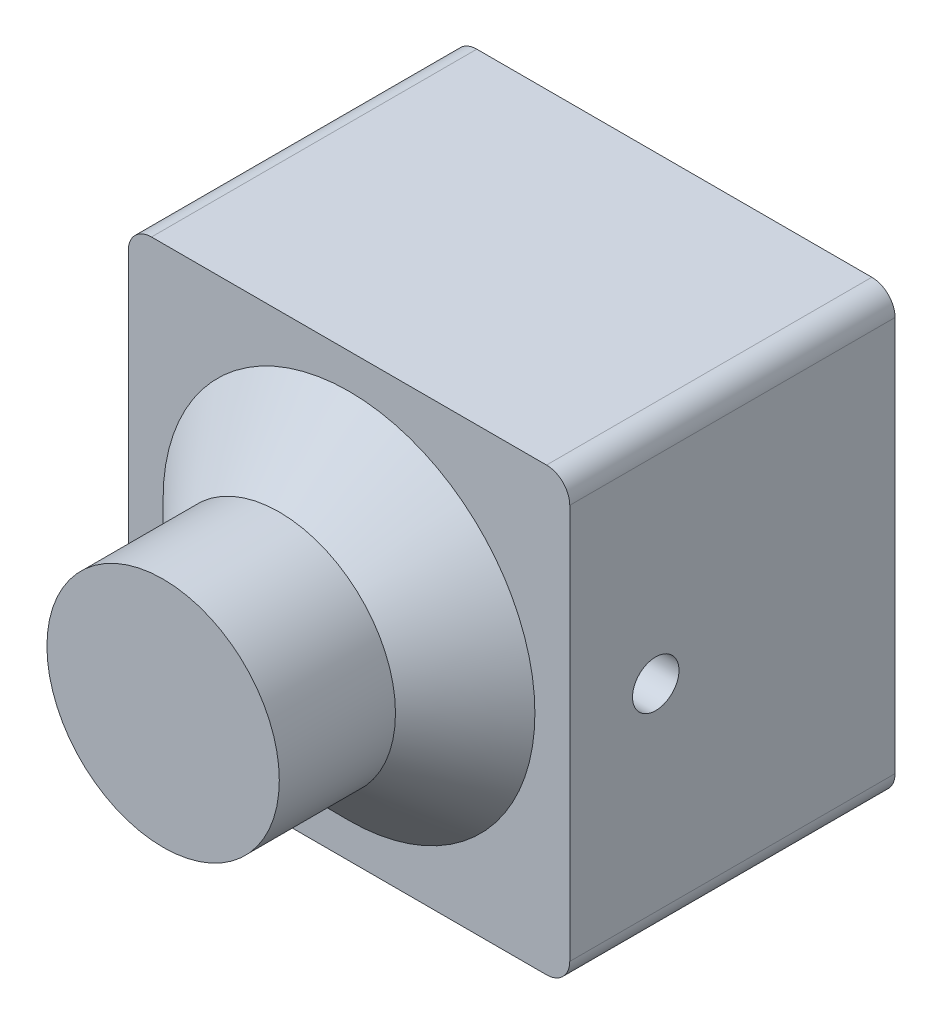
ISO-10303-21;
HEADER;
FILE_DESCRIPTION(('STEP AP214'),'2;1');
FILE_NAME('part.step','',(''),(''),'','','');
FILE_SCHEMA(('AUTOMOTIVE_DESIGN { 1 0 10303 214 1 1 1 1 }'));
ENDSEC;
DATA;
#1=APPLICATION_CONTEXT('core data for automotive mechanical design processes');
#2=APPLICATION_PROTOCOL_DEFINITION('international standard','automotive_design',2000,#1);
#3=PRODUCT_CONTEXT('',#1,'mechanical');
#4=PRODUCT('Part','Part','',(#3));
#5=PRODUCT_RELATED_PRODUCT_CATEGORY('part','',(#4));
#6=PRODUCT_DEFINITION_FORMATION('','',#4);
#7=PRODUCT_DEFINITION_CONTEXT('part definition',#1,'design');
#8=PRODUCT_DEFINITION('design','',#6,#7);
#9=PRODUCT_DEFINITION_SHAPE('','',#8);
#10=(LENGTH_UNIT() NAMED_UNIT(*) SI_UNIT(.MILLI.,.METRE.));
#11=(NAMED_UNIT(*) PLANE_ANGLE_UNIT() SI_UNIT($,.RADIAN.));
#12=(NAMED_UNIT(*) SI_UNIT($,.STERADIAN.) SOLID_ANGLE_UNIT());
#13=UNCERTAINTY_MEASURE_WITH_UNIT(LENGTH_MEASURE(1.E-05),#10,'distance_accuracy_value','');
#14=(GEOMETRIC_REPRESENTATION_CONTEXT(3) GLOBAL_UNCERTAINTY_ASSIGNED_CONTEXT((#13)) GLOBAL_UNIT_ASSIGNED_CONTEXT((#10,
#11,#12)) REPRESENTATION_CONTEXT('',''));
#15=CARTESIAN_POINT('',(0.,0.,0.));
#16=DIRECTION('',(0.,0.,1.));
#17=DIRECTION('',(1.,0.,0.));
#18=AXIS2_PLACEMENT_3D('',#15,#16,#17);
#19=CARTESIAN_POINT('',(56.7274337707558,61.4616075226777,14.));
#20=DIRECTION('',(1.,0.,0.));
#21=DIRECTION('',(0.,1.,0.));
#22=AXIS2_PLACEMENT_3D('',#19,#20,#21);
#23=PLANE('',#22);
#24=CARTESIAN_POINT('',(56.7274337707558,51.9616075226777,10.3));
#25=DIRECTION('',(-1.,0.,0.));
#26=DIRECTION('',(0.,-1.,0.));
#27=AXIS2_PLACEMENT_3D('',#24,#25,#26);
#28=CIRCLE('',#27,1.);
#29=CARTESIAN_POINT('',(56.7274337707558,50.9616075226777,10.3));
#30=VERTEX_POINT('',#29);
#31=EDGE_CURVE('E232',#30,#30,#28,.T.);
#32=ORIENTED_EDGE('',*,*,#31,.F.);
#33=EDGE_LOOP('',(#32));
#34=FACE_BOUND('',#33,.T.);
#35=DIRECTION('',(0.,-1.,0.));
#36=VECTOR('',#35,1.);
#37=CARTESIAN_POINT('',(56.7274337707558,61.4616075226777,0.));
#38=LINE('',#37,#36);
#39=CARTESIAN_POINT('',(56.7274337707558,60.4616075226777,0.));
#40=VERTEX_POINT('',#39);
#41=CARTESIAN_POINT('',(56.7274337707557,43.4616075226777,0.));
#42=VERTEX_POINT('',#41);
#43=EDGE_CURVE('E134',#40,#42,#38,.T.);
#44=ORIENTED_EDGE('',*,*,#43,.T.);
#45=DIRECTION('',(0.,0.,-1.));
#46=VECTOR('',#45,1.);
#47=CARTESIAN_POINT('',(56.7274337707557,43.4616075226777,14.));
#48=LINE('',#47,#46);
#49=CARTESIAN_POINT('',(56.7274337707557,43.4616075226777,14.));
#50=VERTEX_POINT('',#49);
#51=EDGE_CURVE('E156',#42,#50,#48,.F.);
#52=ORIENTED_EDGE('',*,*,#51,.T.);
#53=DIRECTION('',(0.,-1.,0.));
#54=VECTOR('',#53,1.);
#55=CARTESIAN_POINT('',(56.7274337707558,61.4616075226777,14.));
#56=LINE('',#55,#54);
#57=CARTESIAN_POINT('',(56.7274337707558,60.4616075226777,14.));
#58=VERTEX_POINT('',#57);
#59=EDGE_CURVE('E132',#58,#50,#56,.T.);
#60=ORIENTED_EDGE('',*,*,#59,.F.);
#61=DIRECTION('',(0.,0.,-1.));
#62=VECTOR('',#61,1.);
#63=CARTESIAN_POINT('',(56.7274337707558,60.4616075226777,14.));
#64=LINE('',#63,#62);
#65=EDGE_CURVE('E153',#58,#40,#64,.T.);
#66=ORIENTED_EDGE('',*,*,#65,.T.);
#67=EDGE_LOOP('',(#44,#52,#60,#66));
#68=FACE_BOUND('',#67,.T.);
#69=ADVANCED_FACE('F35',(#34,#68),#23,.F.);
#70=CARTESIAN_POINT('',(56.7274337707557,42.4616075226777,14.));
#71=DIRECTION('',(0.,1.,0.));
#72=DIRECTION('',(0.,0.,1.));
#73=AXIS2_PLACEMENT_3D('',#70,#71,#72);
#74=PLANE('',#73);
#75=DIRECTION('',(1.,0.,0.));
#76=VECTOR('',#75,1.);
#77=CARTESIAN_POINT('',(56.7274337707557,42.4616075226777,0.));
#78=LINE('',#77,#76);
#79=CARTESIAN_POINT('',(57.7274337707557,42.4616075226777,0.));
#80=VERTEX_POINT('',#79);
#81=CARTESIAN_POINT('',(74.7274337707558,42.4616075226777,0.));
#82=VERTEX_POINT('',#81);
#83=EDGE_CURVE('E130',#80,#82,#78,.T.);
#84=ORIENTED_EDGE('',*,*,#83,.T.);
#85=DIRECTION('',(0.,0.,-1.));
#86=VECTOR('',#85,1.);
#87=CARTESIAN_POINT('',(74.7274337707558,42.4616075226777,14.));
#88=LINE('',#87,#86);
#89=CARTESIAN_POINT('',(74.7274337707558,42.4616075226777,14.));
#90=VERTEX_POINT('',#89);
#91=EDGE_CURVE('E108',#82,#90,#88,.F.);
#92=ORIENTED_EDGE('',*,*,#91,.T.);
#93=DIRECTION('',(1.,0.,0.));
#94=VECTOR('',#93,1.);
#95=CARTESIAN_POINT('',(56.7274337707557,42.4616075226777,14.));
#96=LINE('',#95,#94);
#97=CARTESIAN_POINT('',(57.7274337707557,42.4616075226777,14.));
#98=VERTEX_POINT('',#97);
#99=EDGE_CURVE('E220',#98,#90,#96,.T.);
#100=ORIENTED_EDGE('',*,*,#99,.F.);
#101=DIRECTION('',(0.,0.,-1.));
#102=VECTOR('',#101,1.);
#103=CARTESIAN_POINT('',(57.7274337707557,42.4616075226777,14.));
#104=LINE('',#103,#102);
#105=EDGE_CURVE('E113',#98,#80,#104,.T.);
#106=ORIENTED_EDGE('',*,*,#105,.T.);
#107=EDGE_LOOP('',(#84,#92,#100,#106));
#108=FACE_BOUND('',#107,.T.);
#109=ADVANCED_FACE('F182',(#108),#74,.F.);
#110=CARTESIAN_POINT('',(75.7274337707558,61.4616075226777,14.));
#111=DIRECTION('',(-1.,0.,0.));
#112=DIRECTION('',(0.,0.,1.));
#113=AXIS2_PLACEMENT_3D('',#110,#111,#112);
#114=PLANE('',#113);
#115=CARTESIAN_POINT('',(75.7274337707558,51.9616075226777,10.3));
#116=DIRECTION('',(1.,0.,0.));
#117=DIRECTION('',(0.,0.,-1.));
#118=AXIS2_PLACEMENT_3D('',#115,#116,#117);
#119=CIRCLE('',#118,1.);
#120=CARTESIAN_POINT('',(75.7274337707558,51.9616075226777,9.3));
#121=VERTEX_POINT('',#120);
#122=EDGE_CURVE('E239',#121,#121,#119,.T.);
#123=ORIENTED_EDGE('',*,*,#122,.F.);
#124=EDGE_LOOP('',(#123));
#125=FACE_BOUND('',#124,.T.);
#126=DIRECTION('',(0.,1.,0.));
#127=VECTOR('',#126,1.);
#128=CARTESIAN_POINT('',(75.7274337707558,61.4616075226777,14.));
#129=LINE('',#128,#127);
#130=CARTESIAN_POINT('',(75.7274337707558,43.4616075226777,14.));
#131=VERTEX_POINT('',#130);
#132=CARTESIAN_POINT('',(75.7274337707558,60.4616075226777,14.));
#133=VERTEX_POINT('',#132);
#134=EDGE_CURVE('E122',#131,#133,#129,.T.);
#135=ORIENTED_EDGE('',*,*,#134,.F.);
#136=DIRECTION('',(0.,0.,-1.));
#137=VECTOR('',#136,1.);
#138=CARTESIAN_POINT('',(75.7274337707558,43.4616075226777,14.));
#139=LINE('',#138,#137);
#140=CARTESIAN_POINT('',(75.7274337707558,43.4616075226777,0.));
#141=VERTEX_POINT('',#140);
#142=EDGE_CURVE('E107',#131,#141,#139,.T.);
#143=ORIENTED_EDGE('',*,*,#142,.T.);
#144=DIRECTION('',(0.,1.,0.));
#145=VECTOR('',#144,1.);
#146=CARTESIAN_POINT('',(75.7274337707558,61.4616075226777,0.));
#147=LINE('',#146,#145);
#148=CARTESIAN_POINT('',(75.7274337707558,60.4616075226777,0.));
#149=VERTEX_POINT('',#148);
#150=EDGE_CURVE('E120',#141,#149,#147,.T.);
#151=ORIENTED_EDGE('',*,*,#150,.T.);
#152=DIRECTION('',(0.,0.,-1.));
#153=VECTOR('',#152,1.);
#154=CARTESIAN_POINT('',(75.7274337707558,60.4616075226777,14.));
#155=LINE('',#154,#153);
#156=EDGE_CURVE('E124',#149,#133,#155,.F.);
#157=ORIENTED_EDGE('',*,*,#156,.T.);
#158=EDGE_LOOP('',(#135,#143,#151,#157));
#159=FACE_BOUND('',#158,.T.);
#160=ADVANCED_FACE('F119',(#125,#159),#114,.F.);
#161=CARTESIAN_POINT('',(56.7274337707558,61.4616075226777,14.));
#162=DIRECTION('',(0.,-1.,0.));
#163=DIRECTION('',(0.,0.,-1.));
#164=AXIS2_PLACEMENT_3D('',#161,#162,#163);
#165=PLANE('',#164);
#166=DIRECTION('',(-1.,0.,0.));
#167=VECTOR('',#166,1.);
#168=CARTESIAN_POINT('',(56.7274337707558,61.4616075226777,14.));
#169=LINE('',#168,#167);
#170=CARTESIAN_POINT('',(74.7274337707558,61.4616075226777,14.));
#171=VERTEX_POINT('',#170);
#172=CARTESIAN_POINT('',(57.7274337707558,61.4616075226777,14.));
#173=VERTEX_POINT('',#172);
#174=EDGE_CURVE('E138',#171,#173,#169,.T.);
#175=ORIENTED_EDGE('',*,*,#174,.F.);
#176=DIRECTION('',(0.,0.,-1.));
#177=VECTOR('',#176,1.);
#178=CARTESIAN_POINT('',(74.7274337707558,61.4616075226777,14.));
#179=LINE('',#178,#177);
#180=CARTESIAN_POINT('',(74.7274337707558,61.4616075226777,0.));
#181=VERTEX_POINT('',#180);
#182=EDGE_CURVE('E159',#171,#181,#179,.T.);
#183=ORIENTED_EDGE('',*,*,#182,.T.);
#184=DIRECTION('',(-1.,0.,0.));
#185=VECTOR('',#184,1.);
#186=CARTESIAN_POINT('',(56.7274337707558,61.4616075226777,0.));
#187=LINE('',#186,#185);
#188=CARTESIAN_POINT('',(57.7274337707558,61.4616075226777,0.));
#189=VERTEX_POINT('',#188);
#190=EDGE_CURVE('E129',#181,#189,#187,.T.);
#191=ORIENTED_EDGE('',*,*,#190,.T.);
#192=DIRECTION('',(0.,0.,-1.));
#193=VECTOR('',#192,1.);
#194=CARTESIAN_POINT('',(57.7274337707558,61.4616075226777,14.));
#195=LINE('',#194,#193);
#196=EDGE_CURVE('E51',#189,#173,#195,.F.);
#197=ORIENTED_EDGE('',*,*,#196,.T.);
#198=EDGE_LOOP('',(#175,#183,#191,#197));
#199=FACE_BOUND('',#198,.T.);
#200=ADVANCED_FACE('F254',(#199),#165,.F.);
#201=CARTESIAN_POINT('',(0.,0.,14.));
#202=DIRECTION('',(0.,0.,1.));
#203=DIRECTION('',(1.,0.,0.));
#204=AXIS2_PLACEMENT_3D('',#201,#202,#203);
#205=PLANE('',#204);
#206=CARTESIAN_POINT('',(66.2274337707558,51.9616075226777,14.));
#207=DIRECTION('',(0.,0.,1.));
#208=DIRECTION('',(1.,0.,0.));
#209=AXIS2_PLACEMENT_3D('',#206,#207,#208);
#210=CIRCLE('',#209,8.00000000000001);
#211=CARTESIAN_POINT('',(58.2274337707557,51.9616075226777,14.));
#212=VERTEX_POINT('',#211);
#213=EDGE_CURVE('E11',#212,#212,#210,.F.);
#214=ORIENTED_EDGE('',*,*,#213,.T.);
#215=EDGE_LOOP('',(#214));
#216=FACE_BOUND('',#215,.T.);
#217=ORIENTED_EDGE('',*,*,#99,.T.);
#218=CARTESIAN_POINT('',(74.7274337707558,43.4616075226777,14.));
#219=DIRECTION('',(0.,0.,1.));
#220=DIRECTION('',(1.,0.,0.));
#221=AXIS2_PLACEMENT_3D('',#218,#219,#220);
#222=CIRCLE('',#221,1.);
#223=EDGE_CURVE('E151',#90,#131,#222,.T.);
#224=ORIENTED_EDGE('',*,*,#223,.T.);
#225=ORIENTED_EDGE('',*,*,#134,.T.);
#226=CARTESIAN_POINT('',(74.7274337707558,60.4616075226777,14.));
#227=DIRECTION('',(0.,0.,1.));
#228=DIRECTION('',(1.,0.,0.));
#229=AXIS2_PLACEMENT_3D('',#226,#227,#228);
#230=CIRCLE('',#229,1.);
#231=EDGE_CURVE('E58',#133,#171,#230,.T.);
#232=ORIENTED_EDGE('',*,*,#231,.T.);
#233=ORIENTED_EDGE('',*,*,#174,.T.);
#234=CARTESIAN_POINT('',(57.7274337707558,60.4616075226777,14.));
#235=DIRECTION('',(0.,0.,1.));
#236=DIRECTION('',(1.,0.,0.));
#237=AXIS2_PLACEMENT_3D('',#234,#235,#236);
#238=CIRCLE('',#237,1.);
#239=EDGE_CURVE('E146',#173,#58,#238,.T.);
#240=ORIENTED_EDGE('',*,*,#239,.T.);
#241=ORIENTED_EDGE('',*,*,#59,.T.);
#242=CARTESIAN_POINT('',(57.7274337707557,43.4616075226777,14.));
#243=DIRECTION('',(0.,0.,1.));
#244=DIRECTION('',(1.,0.,0.));
#245=AXIS2_PLACEMENT_3D('',#242,#243,#244);
#246=CIRCLE('',#245,1.);
#247=EDGE_CURVE('E149',#50,#98,#246,.T.);
#248=ORIENTED_EDGE('',*,*,#247,.T.);
#249=EDGE_LOOP('',(#217,#224,#225,#232,#233,#240,#241,#248));
#250=FACE_BOUND('',#249,.T.);
#251=ADVANCED_FACE('F215',(#216,#250),#205,.T.);
#252=CARTESIAN_POINT('',(0.,0.,0.));
#253=DIRECTION('',(0.,0.,1.));
#254=DIRECTION('',(1.,0.,0.));
#255=AXIS2_PLACEMENT_3D('',#252,#253,#254);
#256=PLANE('',#255);
#257=ORIENTED_EDGE('',*,*,#150,.F.);
#258=CARTESIAN_POINT('',(74.7274337707558,43.4616075226777,0.));
#259=DIRECTION('',(0.,0.,1.));
#260=DIRECTION('',(1.,0.,0.));
#261=AXIS2_PLACEMENT_3D('',#258,#259,#260);
#262=CIRCLE('',#261,1.);
#263=EDGE_CURVE('E103',#141,#82,#262,.F.);
#264=ORIENTED_EDGE('',*,*,#263,.T.);
#265=ORIENTED_EDGE('',*,*,#83,.F.);
#266=CARTESIAN_POINT('',(57.7274337707557,43.4616075226777,0.));
#267=DIRECTION('',(0.,0.,1.));
#268=DIRECTION('',(1.,0.,0.));
#269=AXIS2_PLACEMENT_3D('',#266,#267,#268);
#270=CIRCLE('',#269,1.);
#271=EDGE_CURVE('E114',#80,#42,#270,.F.);
#272=ORIENTED_EDGE('',*,*,#271,.T.);
#273=ORIENTED_EDGE('',*,*,#43,.F.);
#274=CARTESIAN_POINT('',(57.7274337707558,60.4616075226777,0.));
#275=DIRECTION('',(0.,0.,1.));
#276=DIRECTION('',(1.,0.,0.));
#277=AXIS2_PLACEMENT_3D('',#274,#275,#276);
#278=CIRCLE('',#277,1.);
#279=EDGE_CURVE('E123',#40,#189,#278,.F.);
#280=ORIENTED_EDGE('',*,*,#279,.T.);
#281=ORIENTED_EDGE('',*,*,#190,.F.);
#282=CARTESIAN_POINT('',(74.7274337707558,60.4616075226777,0.));
#283=DIRECTION('',(0.,0.,1.));
#284=DIRECTION('',(1.,0.,0.));
#285=AXIS2_PLACEMENT_3D('',#282,#283,#284);
#286=CIRCLE('',#285,1.);
#287=EDGE_CURVE('E128',#181,#149,#286,.F.);
#288=ORIENTED_EDGE('',*,*,#287,.T.);
#289=EDGE_LOOP('',(#257,#264,#265,#272,#273,#280,#281,#288));
#290=FACE_BOUND('',#289,.T.);
#291=ADVANCED_FACE('F126',(#290),#256,.F.);
#292=CARTESIAN_POINT('',(74.7274337707558,43.4616075226777,14.));
#293=DIRECTION('',(0.,0.,-1.));
#294=DIRECTION('',(-1.,0.,0.));
#295=AXIS2_PLACEMENT_3D('',#292,#293,#294);
#296=CYLINDRICAL_SURFACE('',#295,1.);
#297=ORIENTED_EDGE('',*,*,#223,.F.);
#298=ORIENTED_EDGE('',*,*,#91,.F.);
#299=ORIENTED_EDGE('',*,*,#263,.F.);
#300=ORIENTED_EDGE('',*,*,#142,.F.);
#301=EDGE_LOOP('',(#297,#298,#299,#300));
#302=FACE_BOUND('',#301,.T.);
#303=ADVANCED_FACE('F106',(#302),#296,.T.);
#304=CARTESIAN_POINT('',(57.7274337707557,43.4616075226777,14.));
#305=DIRECTION('',(0.,0.,-1.));
#306=DIRECTION('',(-1.,0.,0.));
#307=AXIS2_PLACEMENT_3D('',#304,#305,#306);
#308=CYLINDRICAL_SURFACE('',#307,1.);
#309=ORIENTED_EDGE('',*,*,#247,.F.);
#310=ORIENTED_EDGE('',*,*,#51,.F.);
#311=ORIENTED_EDGE('',*,*,#271,.F.);
#312=ORIENTED_EDGE('',*,*,#105,.F.);
#313=EDGE_LOOP('',(#309,#310,#311,#312));
#314=FACE_BOUND('',#313,.T.);
#315=ADVANCED_FACE('F196',(#314),#308,.T.);
#316=CARTESIAN_POINT('',(74.7274337707558,60.4616075226777,14.));
#317=DIRECTION('',(0.,0.,-1.));
#318=DIRECTION('',(-1.,0.,0.));
#319=AXIS2_PLACEMENT_3D('',#316,#317,#318);
#320=CYLINDRICAL_SURFACE('',#319,1.);
#321=ORIENTED_EDGE('',*,*,#231,.F.);
#322=ORIENTED_EDGE('',*,*,#156,.F.);
#323=ORIENTED_EDGE('',*,*,#287,.F.);
#324=ORIENTED_EDGE('',*,*,#182,.F.);
#325=EDGE_LOOP('',(#321,#322,#323,#324));
#326=FACE_BOUND('',#325,.T.);
#327=ADVANCED_FACE('F199',(#326),#320,.T.);
#328=CARTESIAN_POINT('',(57.7274337707558,60.4616075226777,14.));
#329=DIRECTION('',(0.,0.,-1.));
#330=DIRECTION('',(-1.,0.,0.));
#331=AXIS2_PLACEMENT_3D('',#328,#329,#330);
#332=CYLINDRICAL_SURFACE('',#331,1.);
#333=ORIENTED_EDGE('',*,*,#239,.F.);
#334=ORIENTED_EDGE('',*,*,#196,.F.);
#335=ORIENTED_EDGE('',*,*,#279,.F.);
#336=ORIENTED_EDGE('',*,*,#65,.F.);
#337=EDGE_LOOP('',(#333,#334,#335,#336));
#338=FACE_BOUND('',#337,.T.);
#339=ADVANCED_FACE('F202',(#338),#332,.T.);
#340=CARTESIAN_POINT('',(66.2274337707558,51.9616075226777,22.));
#341=DIRECTION('',(0.,0.,-1.));
#342=DIRECTION('',(-1.,0.,0.));
#343=AXIS2_PLACEMENT_3D('',#340,#341,#342);
#344=CYLINDRICAL_SURFACE('',#343,5.00000000000001);
#345=CARTESIAN_POINT('',(66.2274337707558,51.9616075226777,17.));
#346=DIRECTION('',(0.,0.,1.));
#347=DIRECTION('',(1.,0.,0.));
#348=AXIS2_PLACEMENT_3D('',#345,#346,#347);
#349=CIRCLE('',#348,5.00000000000001);
#350=CARTESIAN_POINT('',(61.2274337707558,51.9616075226777,17.));
#351=VERTEX_POINT('',#350);
#352=EDGE_CURVE('E44',#351,#351,#349,.T.);
#353=ORIENTED_EDGE('',*,*,#352,.T.);
#354=EDGE_LOOP('',(#353));
#355=FACE_BOUND('',#354,.T.);
#356=CARTESIAN_POINT('',(66.2274337707558,51.9616075226777,22.));
#357=DIRECTION('',(0.,0.,1.));
#358=DIRECTION('',(1.,0.,0.));
#359=AXIS2_PLACEMENT_3D('',#356,#357,#358);
#360=CIRCLE('',#359,5.00000000000001);
#361=CARTESIAN_POINT('',(71.2274337707558,51.9616075226777,22.));
#362=VERTEX_POINT('',#361);
#363=EDGE_CURVE('E224',#362,#362,#360,.T.);
#364=ORIENTED_EDGE('',*,*,#363,.F.);
#365=EDGE_LOOP('',(#364));
#366=FACE_BOUND('',#365,.T.);
#367=ADVANCED_FACE('F164',(#355,#366),#344,.T.);
#368=CARTESIAN_POINT('',(66.2274337707558,51.9616075226777,22.));
#369=DIRECTION('',(0.,0.,1.));
#370=DIRECTION('',(1.,0.,0.));
#371=AXIS2_PLACEMENT_3D('',#368,#369,#370);
#372=PLANE('',#371);
#373=ORIENTED_EDGE('',*,*,#363,.T.);
#374=EDGE_LOOP('',(#373));
#375=FACE_BOUND('',#374,.T.);
#376=ADVANCED_FACE('F169',(#375),#372,.T.);
#377=CARTESIAN_POINT('',(66.2274337707558,51.9616075226777,17.));
#378=DIRECTION('',(0.,0.,-1.));
#379=DIRECTION('',(-1.,0.,0.));
#380=AXIS2_PLACEMENT_3D('',#377,#378,#379);
#381=CONICAL_SURFACE('',#380,5.00000000000001,0.785398163397443);
#382=CARTESIAN_POINT('',(58.2274337707557,51.9616075226777,14.));
#383=CARTESIAN_POINT('',(58.2586837707558,51.9616075226777,14.03125));
#384=CARTESIAN_POINT('',(58.2899337707557,51.9616075226777,14.0625));
#385=CARTESIAN_POINT('',(58.3524337707557,51.9616075226777,14.125));
#386=CARTESIAN_POINT('',(58.3836837707558,51.9616075226777,14.15625));
#387=CARTESIAN_POINT('',(58.4461837707557,51.9616075226777,14.21875));
#388=CARTESIAN_POINT('',(58.4774337707557,51.9616075226777,14.25));
#389=CARTESIAN_POINT('',(58.5399337707557,51.9616075226777,14.3125));
#390=CARTESIAN_POINT('',(58.5711837707557,51.9616075226777,14.34375));
#391=CARTESIAN_POINT('',(58.6336837707557,51.9616075226777,14.40625));
#392=CARTESIAN_POINT('',(58.6649337707557,51.9616075226777,14.4375));
#393=CARTESIAN_POINT('',(58.7274337707557,51.9616075226777,14.5));
#394=CARTESIAN_POINT('',(58.7586837707557,51.9616075226777,14.53125));
#395=CARTESIAN_POINT('',(58.8211837707557,51.9616075226777,14.59375));
#396=CARTESIAN_POINT('',(58.8524337707557,51.9616075226777,14.625));
#397=CARTESIAN_POINT('',(58.9149337707557,51.9616075226777,14.6875));
#398=CARTESIAN_POINT('',(58.9461837707557,51.9616075226777,14.71875));
#399=CARTESIAN_POINT('',(59.0086837707557,51.9616075226777,14.78125));
#400=CARTESIAN_POINT('',(59.0399337707557,51.9616075226777,14.8125));
#401=CARTESIAN_POINT('',(59.1024337707557,51.9616075226777,14.875));
#402=CARTESIAN_POINT('',(59.1336837707557,51.9616075226777,14.90625));
#403=CARTESIAN_POINT('',(59.1961837707557,51.9616075226777,14.96875));
#404=CARTESIAN_POINT('',(59.2274337707557,51.9616075226777,15.));
#405=CARTESIAN_POINT('',(59.2899337707557,51.9616075226777,15.0625));
#406=CARTESIAN_POINT('',(59.3211837707557,51.9616075226777,15.09375));
#407=CARTESIAN_POINT('',(59.3836837707557,51.9616075226777,15.15625));
#408=CARTESIAN_POINT('',(59.4149337707557,51.9616075226777,15.1875));
#409=CARTESIAN_POINT('',(59.4774337707557,51.9616075226777,15.25));
#410=CARTESIAN_POINT('',(59.5086837707557,51.9616075226777,15.28125));
#411=CARTESIAN_POINT('',(59.5711837707557,51.9616075226777,15.34375));
#412=CARTESIAN_POINT('',(59.6024337707557,51.9616075226777,15.375));
#413=CARTESIAN_POINT('',(59.6649337707557,51.9616075226777,15.4375));
#414=CARTESIAN_POINT('',(59.6961837707557,51.9616075226777,15.46875));
#415=CARTESIAN_POINT('',(59.7586837707557,51.9616075226777,15.53125));
#416=CARTESIAN_POINT('',(59.7899337707557,51.9616075226777,15.5625));
#417=CARTESIAN_POINT('',(59.8524337707557,51.9616075226777,15.625));
#418=CARTESIAN_POINT('',(59.8836837707557,51.9616075226777,15.65625));
#419=CARTESIAN_POINT('',(59.9461837707557,51.9616075226777,15.71875));
#420=CARTESIAN_POINT('',(59.9774337707557,51.9616075226777,15.75));
#421=CARTESIAN_POINT('',(60.0399337707557,51.9616075226777,15.8125));
#422=CARTESIAN_POINT('',(60.0711837707557,51.9616075226777,15.84375));
#423=CARTESIAN_POINT('',(60.1336837707557,51.9616075226777,15.90625));
#424=CARTESIAN_POINT('',(60.1649337707557,51.9616075226777,15.9375));
#425=CARTESIAN_POINT('',(60.2274337707557,51.9616075226777,16.));
#426=CARTESIAN_POINT('',(60.2586837707557,51.9616075226777,16.03125));
#427=CARTESIAN_POINT('',(60.3211837707557,51.9616075226777,16.09375));
#428=CARTESIAN_POINT('',(60.3524337707557,51.9616075226777,16.125));
#429=CARTESIAN_POINT('',(60.4149337707557,51.9616075226777,16.1875));
#430=CARTESIAN_POINT('',(60.4461837707557,51.9616075226777,16.21875));
#431=CARTESIAN_POINT('',(60.5086837707557,51.9616075226777,16.28125));
#432=CARTESIAN_POINT('',(60.5399337707557,51.9616075226777,16.3125));
#433=CARTESIAN_POINT('',(60.6024337707557,51.9616075226777,16.375));
#434=CARTESIAN_POINT('',(60.6336837707557,51.9616075226777,16.40625));
#435=CARTESIAN_POINT('',(60.6961837707557,51.9616075226777,16.46875));
#436=CARTESIAN_POINT('',(60.7274337707557,51.9616075226777,16.5));
#437=CARTESIAN_POINT('',(60.7899337707557,51.9616075226777,16.5625));
#438=CARTESIAN_POINT('',(60.8211837707557,51.9616075226777,16.59375));
#439=CARTESIAN_POINT('',(60.8836837707557,51.9616075226777,16.65625));
#440=CARTESIAN_POINT('',(60.9149337707557,51.9616075226777,16.6875));
#441=CARTESIAN_POINT('',(60.9774337707557,51.9616075226777,16.75));
#442=CARTESIAN_POINT('',(61.0086837707557,51.9616075226777,16.78125));
#443=CARTESIAN_POINT('',(61.0711837707557,51.9616075226777,16.84375));
#444=CARTESIAN_POINT('',(61.1024337707558,51.9616075226777,16.875));
#445=CARTESIAN_POINT('',(61.1649337707558,51.9616075226777,16.9375));
#446=CARTESIAN_POINT('',(61.1961837707557,51.9616075226777,16.96875));
#447=CARTESIAN_POINT('',(61.2274337707558,51.9616075226777,17.));
#448=B_SPLINE_CURVE_WITH_KNOTS('',3,(#382,#383,#384,#385,#386,#387,#388,#389,#390,#391,#392,
#393,#394,#395,#396,#397,#398,#399,#400,#401,#402,#403,#404,#405,#406,#407,#408,#409,#410,#411,
#412,#413,#414,#415,#416,#417,#418,#419,#420,#421,#422,#423,#424,#425,#426,#427,#428,#429,#430,
#431,#432,#433,#434,#435,#436,#437,#438,#439,#440,#441,#442,#443,#444,#445,#446,#447),
.UNSPECIFIED.,.F.,.F.,(4,2,2,2,2,2,2,2,2,2,2,2,2,2,2,2,2,2,2,2,2,2,2,2,2,2,2,2,2,2,2,2,4),(0.,
0.13258252147248,0.265165042944957,0.397747564417432,0.530330085889913,0.662912607362389,
0.79549512883487,0.928077650307346,1.06066017177983,1.1932426932523,1.32582521472478,
1.45840773619726,1.59099025766974,1.72357277914222,1.8561553006147,1.98873782208717,
2.12132034355965,2.25390286503213,2.38648538650461,2.51906790797709,2.65165042944957,
2.78423295092204,2.91681547239452,3.049397993867,3.18198051533948,3.31456303681196,
3.44714555828444,3.57972807975691,3.7123106012294,3.84489312270187,3.97747564417435,
4.11005816564683,4.24264068711931),.UNSPECIFIED.);
#449=EDGE_CURVE('BSEAM38',#212,#351,#448,.T.);
#450=ORIENTED_EDGE('',*,*,#213,.F.);
#451=ORIENTED_EDGE('',*,*,#352,.F.);
#452=ORIENTED_EDGE('',*,*,#449,.T.);
#453=ORIENTED_EDGE('',*,*,#449,.F.);
#454=EDGE_LOOP('',(#450,#452,#451,#453));
#455=FACE_BOUND('',#454,.T.);
#456=ADVANCED_FACE('F38',(#455),#381,.T.);
#457=CARTESIAN_POINT('',(61.7274337707558,51.9616075226777,10.3));
#458=DIRECTION('',(-1.,0.,0.));
#459=DIRECTION('',(0.,-1.,0.));
#460=AXIS2_PLACEMENT_3D('',#457,#458,#459);
#461=CYLINDRICAL_SURFACE('',#460,1.);
#462=CARTESIAN_POINT('',(61.7274337707558,51.9616075226777,10.3));
#463=DIRECTION('',(-1.,0.,0.));
#464=DIRECTION('',(0.,-1.,0.));
#465=AXIS2_PLACEMENT_3D('',#462,#463,#464);
#466=CIRCLE('',#465,1.);
#467=CARTESIAN_POINT('',(61.7274337707558,50.9616075226777,10.3));
#468=VERTEX_POINT('',#467);
#469=EDGE_CURVE('E229',#468,#468,#466,.T.);
#470=ORIENTED_EDGE('',*,*,#469,.F.);
#471=EDGE_LOOP('',(#470));
#472=FACE_BOUND('',#471,.T.);
#473=ORIENTED_EDGE('',*,*,#31,.T.);
#474=EDGE_LOOP('',(#473));
#475=FACE_BOUND('',#474,.T.);
#476=ADVANCED_FACE('F168',(#472,#475),#461,.F.);
#477=CARTESIAN_POINT('',(61.7274337707558,51.9616075226777,10.3));
#478=DIRECTION('',(-1.,0.,0.));
#479=DIRECTION('',(0.,-1.,0.));
#480=AXIS2_PLACEMENT_3D('',#477,#478,#479);
#481=PLANE('',#480);
#482=ORIENTED_EDGE('',*,*,#469,.T.);
#483=EDGE_LOOP('',(#482));
#484=FACE_BOUND('',#483,.T.);
#485=ADVANCED_FACE('F175',(#484),#481,.T.);
#486=CARTESIAN_POINT('',(70.7274337707557,51.9616075226777,10.3));
#487=DIRECTION('',(1.,0.,0.));
#488=DIRECTION('',(0.,0.,-1.));
#489=AXIS2_PLACEMENT_3D('',#486,#487,#488);
#490=CYLINDRICAL_SURFACE('',#489,1.);
#491=CARTESIAN_POINT('',(70.7274337707557,51.9616075226777,10.3));
#492=DIRECTION('',(1.,0.,0.));
#493=DIRECTION('',(0.,0.,-1.));
#494=AXIS2_PLACEMENT_3D('',#491,#492,#493);
#495=CIRCLE('',#494,1.);
#496=CARTESIAN_POINT('',(70.7274337707557,51.9616075226777,9.3));
#497=VERTEX_POINT('',#496);
#498=EDGE_CURVE('E237',#497,#497,#495,.T.);
#499=ORIENTED_EDGE('',*,*,#498,.F.);
#500=EDGE_LOOP('',(#499));
#501=FACE_BOUND('',#500,.T.);
#502=ORIENTED_EDGE('',*,*,#122,.T.);
#503=EDGE_LOOP('',(#502));
#504=FACE_BOUND('',#503,.T.);
#505=ADVANCED_FACE('F247',(#501,#504),#490,.F.);
#506=CARTESIAN_POINT('',(70.7274337707557,51.9616075226777,10.3));
#507=DIRECTION('',(1.,0.,0.));
#508=DIRECTION('',(0.,0.,-1.));
#509=AXIS2_PLACEMENT_3D('',#506,#507,#508);
#510=PLANE('',#509);
#511=ORIENTED_EDGE('',*,*,#498,.T.);
#512=EDGE_LOOP('',(#511));
#513=FACE_BOUND('',#512,.T.);
#514=ADVANCED_FACE('F245',(#513),#510,.T.);
#515=CLOSED_SHELL('',(#69,#109,#160,#200,#251,#291,#303,#315,#327,#339,#367,#376,#456,#476,#485,
#505,#514));
#516=MANIFOLD_SOLID_BREP('B2',#515);
#517=ADVANCED_BREP_SHAPE_REPRESENTATION('',(#18,#516),#14);
#518=SHAPE_DEFINITION_REPRESENTATION(#9,#517);
ENDSEC;
END-ISO-10303-21;
